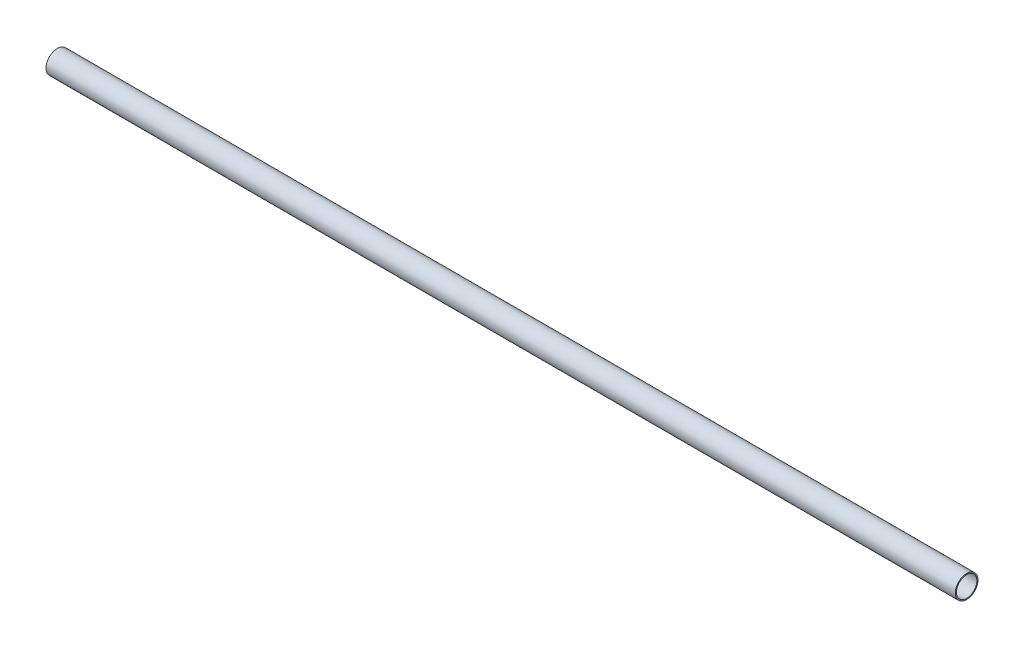
ISO-10303-21;
HEADER;
FILE_DESCRIPTION(('STEP AP214'),'2;1');
FILE_NAME('part.step','',(''),(''),'','','');
FILE_SCHEMA(('AUTOMOTIVE_DESIGN { 1 0 10303 214 1 1 1 1 }'));
ENDSEC;
DATA;
#1=APPLICATION_CONTEXT('core data for automotive mechanical design processes');
#2=APPLICATION_PROTOCOL_DEFINITION('international standard','automotive_design',2000,#1);
#3=PRODUCT_CONTEXT('',#1,'mechanical');
#4=PRODUCT('Part','Part','',(#3));
#5=PRODUCT_RELATED_PRODUCT_CATEGORY('part','',(#4));
#6=PRODUCT_DEFINITION_FORMATION('','',#4);
#7=PRODUCT_DEFINITION_CONTEXT('part definition',#1,'design');
#8=PRODUCT_DEFINITION('design','',#6,#7);
#9=PRODUCT_DEFINITION_SHAPE('','',#8);
#10=(LENGTH_UNIT() NAMED_UNIT(*) SI_UNIT(.MILLI.,.METRE.));
#11=(NAMED_UNIT(*) PLANE_ANGLE_UNIT() SI_UNIT($,.RADIAN.));
#12=(NAMED_UNIT(*) SI_UNIT($,.STERADIAN.) SOLID_ANGLE_UNIT());
#13=UNCERTAINTY_MEASURE_WITH_UNIT(LENGTH_MEASURE(1.E-05),#10,'distance_accuracy_value','');
#14=(GEOMETRIC_REPRESENTATION_CONTEXT(3) GLOBAL_UNCERTAINTY_ASSIGNED_CONTEXT((#13)) GLOBAL_UNIT_ASSIGNED_CONTEXT((#10,
#11,#12)) REPRESENTATION_CONTEXT('',''));
#15=CARTESIAN_POINT('',(0.,0.,0.));
#16=DIRECTION('',(0.,0.,1.));
#17=DIRECTION('',(1.,0.,0.));
#18=AXIS2_PLACEMENT_3D('',#15,#16,#17);
#19=CARTESIAN_POINT('',(400.,0.,0.));
#20=DIRECTION('',(1.,0.,0.));
#21=DIRECTION('',(0.,0.,-1.));
#22=AXIS2_PLACEMENT_3D('',#19,#20,#21);
#23=PLANE('',#22);
#24=CARTESIAN_POINT('',(400.,0.,0.));
#25=DIRECTION('',(1.,0.,0.));
#26=DIRECTION('',(0.,0.,-1.));
#27=AXIS2_PLACEMENT_3D('',#24,#25,#26);
#28=CIRCLE('',#27,5.);
#29=CARTESIAN_POINT('',(400.,0.,-5.));
#30=VERTEX_POINT('',#29);
#31=EDGE_CURVE('E10',#30,#30,#28,.T.);
#32=ORIENTED_EDGE('',*,*,#31,.T.);
#33=EDGE_LOOP('',(#32));
#34=FACE_BOUND('',#33,.T.);
#35=CARTESIAN_POINT('',(400.,0.,0.));
#36=DIRECTION('',(1.,0.,0.));
#37=DIRECTION('',(0.,0.,-1.));
#38=AXIS2_PLACEMENT_3D('',#35,#36,#37);
#39=CIRCLE('',#38,4.5);
#40=CARTESIAN_POINT('',(400.,0.,-4.5));
#41=VERTEX_POINT('',#40);
#42=EDGE_CURVE('E44',#41,#41,#39,.T.);
#43=ORIENTED_EDGE('',*,*,#42,.F.);
#44=EDGE_LOOP('',(#43));
#45=FACE_BOUND('',#44,.T.);
#46=ADVANCED_FACE('F33',(#34,#45),#23,.T.);
#47=CARTESIAN_POINT('',(0.,0.,0.));
#48=DIRECTION('',(1.,0.,0.));
#49=DIRECTION('',(0.,0.,-1.));
#50=AXIS2_PLACEMENT_3D('',#47,#48,#49);
#51=PLANE('',#50);
#52=CARTESIAN_POINT('',(0.,0.,0.));
#53=DIRECTION('',(1.,0.,0.));
#54=DIRECTION('',(0.,0.,-1.));
#55=AXIS2_PLACEMENT_3D('',#52,#53,#54);
#56=CIRCLE('',#55,5.);
#57=CARTESIAN_POINT('',(0.,0.,-5.));
#58=VERTEX_POINT('',#57);
#59=EDGE_CURVE('E37',#58,#58,#56,.T.);
#60=ORIENTED_EDGE('',*,*,#59,.F.);
#61=EDGE_LOOP('',(#60));
#62=FACE_BOUND('',#61,.T.);
#63=CARTESIAN_POINT('',(0.,0.,0.));
#64=DIRECTION('',(1.,0.,0.));
#65=DIRECTION('',(0.,0.,-1.));
#66=AXIS2_PLACEMENT_3D('',#63,#64,#65);
#67=CIRCLE('',#66,4.5);
#68=CARTESIAN_POINT('',(0.,0.,-4.5));
#69=VERTEX_POINT('',#68);
#70=EDGE_CURVE('E46',#69,#69,#67,.T.);
#71=ORIENTED_EDGE('',*,*,#70,.T.);
#72=EDGE_LOOP('',(#71));
#73=FACE_BOUND('',#72,.T.);
#74=ADVANCED_FACE('F56',(#62,#73),#51,.F.);
#75=CARTESIAN_POINT('',(400.,0.,0.));
#76=DIRECTION('',(-1.,0.,0.));
#77=DIRECTION('',(0.,0.,1.));
#78=AXIS2_PLACEMENT_3D('',#75,#76,#77);
#79=CYLINDRICAL_SURFACE('',#78,5.);
#80=ORIENTED_EDGE('',*,*,#31,.F.);
#81=EDGE_LOOP('',(#80));
#82=FACE_BOUND('',#81,.T.);
#83=ORIENTED_EDGE('',*,*,#59,.T.);
#84=EDGE_LOOP('',(#83));
#85=FACE_BOUND('',#84,.T.);
#86=ADVANCED_FACE('F35',(#82,#85),#79,.T.);
#87=CARTESIAN_POINT('',(400.,0.,0.));
#88=DIRECTION('',(-1.,0.,0.));
#89=DIRECTION('',(0.,0.,1.));
#90=AXIS2_PLACEMENT_3D('',#87,#88,#89);
#91=CYLINDRICAL_SURFACE('',#90,4.5);
#92=ORIENTED_EDGE('',*,*,#42,.T.);
#93=EDGE_LOOP('',(#92));
#94=FACE_BOUND('',#93,.T.);
#95=ORIENTED_EDGE('',*,*,#70,.F.);
#96=EDGE_LOOP('',(#95));
#97=FACE_BOUND('',#96,.T.);
#98=ADVANCED_FACE('F52',(#94,#97),#91,.F.);
#99=CLOSED_SHELL('',(#46,#74,#86,#98));
#100=MANIFOLD_SOLID_BREP('B2',#99);
#101=ADVANCED_BREP_SHAPE_REPRESENTATION('',(#18,#100),#14);
#102=SHAPE_DEFINITION_REPRESENTATION(#9,#101);
ENDSEC;
END-ISO-10303-21;
